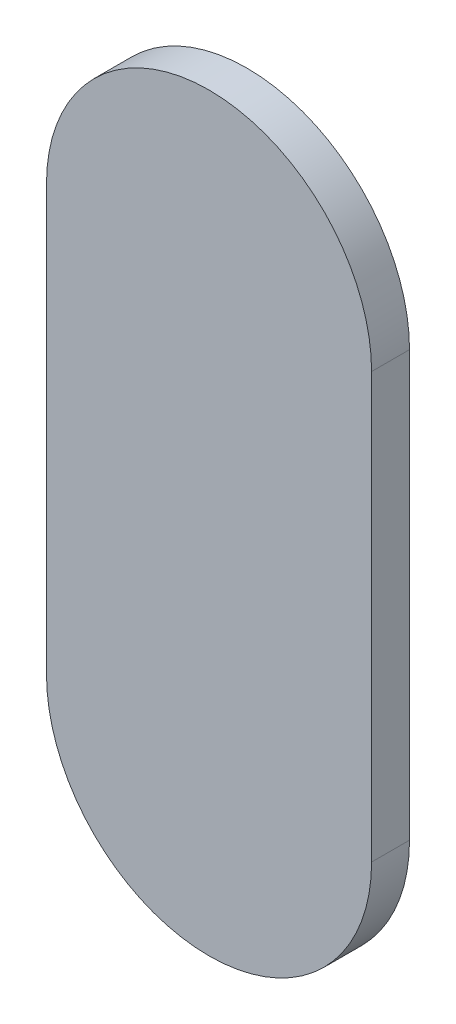
ISO-10303-21;
HEADER;
FILE_DESCRIPTION(('STEP AP214'),'2;1');
FILE_NAME('part.step','',(''),(''),'','','');
FILE_SCHEMA(('AUTOMOTIVE_DESIGN { 1 0 10303 214 1 1 1 1 }'));
ENDSEC;
DATA;
#1=APPLICATION_CONTEXT('core data for automotive mechanical design processes');
#2=APPLICATION_PROTOCOL_DEFINITION('international standard','automotive_design',2000,#1);
#3=PRODUCT_CONTEXT('',#1,'mechanical');
#4=PRODUCT('Part','Part','',(#3));
#5=PRODUCT_RELATED_PRODUCT_CATEGORY('part','',(#4));
#6=PRODUCT_DEFINITION_FORMATION('','',#4);
#7=PRODUCT_DEFINITION_CONTEXT('part definition',#1,'design');
#8=PRODUCT_DEFINITION('design','',#6,#7);
#9=PRODUCT_DEFINITION_SHAPE('','',#8);
#10=(LENGTH_UNIT() NAMED_UNIT(*) SI_UNIT(.MILLI.,.METRE.));
#11=(NAMED_UNIT(*) PLANE_ANGLE_UNIT() SI_UNIT($,.RADIAN.));
#12=(NAMED_UNIT(*) SI_UNIT($,.STERADIAN.) SOLID_ANGLE_UNIT());
#13=UNCERTAINTY_MEASURE_WITH_UNIT(LENGTH_MEASURE(1.E-05),#10,'distance_accuracy_value','');
#14=(GEOMETRIC_REPRESENTATION_CONTEXT(3) GLOBAL_UNCERTAINTY_ASSIGNED_CONTEXT((#13)) GLOBAL_UNIT_ASSIGNED_CONTEXT((#10,
#11,#12)) REPRESENTATION_CONTEXT('',''));
#15=CARTESIAN_POINT('',(0.,0.,0.));
#16=DIRECTION('',(0.,0.,1.));
#17=DIRECTION('',(1.,0.,0.));
#18=AXIS2_PLACEMENT_3D('',#15,#16,#17);
#19=CARTESIAN_POINT('',(129.151,-112.499,1.635));
#20=DIRECTION('',(0.,0.,1.));
#21=DIRECTION('',(1.,0.,0.));
#22=AXIS2_PLACEMENT_3D('',#19,#20,#21);
#23=PLANE('',#22);
#24=DIRECTION('',(0.,-1.,0.));
#25=VECTOR('',#24,1.);
#26=CARTESIAN_POINT('',(129.151,-112.499,1.635));
#27=LINE('',#26,#25);
#28=CARTESIAN_POINT('',(129.151,-112.499,1.635));
#29=VERTEX_POINT('',#28);
#30=CARTESIAN_POINT('',(129.151,-112.891,1.635));
#31=VERTEX_POINT('',#30);
#32=EDGE_CURVE('E99',#29,#31,#27,.T.);
#33=ORIENTED_EDGE('',*,*,#32,.T.);
#34=CARTESIAN_POINT('',(129.301,-112.891,1.635));
#35=DIRECTION('',(0.,0.,1.));
#36=DIRECTION('',(-1.,0.,0.));
#37=AXIS2_PLACEMENT_3D('',#34,#35,#36);
#38=CIRCLE('',#37,0.15);
#39=CARTESIAN_POINT('',(129.451,-112.891,1.635));
#40=VERTEX_POINT('',#39);
#41=EDGE_CURVE('E78',#31,#40,#38,.T.);
#42=ORIENTED_EDGE('',*,*,#41,.T.);
#43=DIRECTION('',(0.,1.,0.));
#44=VECTOR('',#43,1.);
#45=CARTESIAN_POINT('',(129.451,-112.891,1.635));
#46=LINE('',#45,#44);
#47=CARTESIAN_POINT('',(129.451,-112.499,1.635));
#48=VERTEX_POINT('',#47);
#49=EDGE_CURVE('E83',#40,#48,#46,.T.);
#50=ORIENTED_EDGE('',*,*,#49,.T.);
#51=CARTESIAN_POINT('',(129.301,-112.499,1.635));
#52=DIRECTION('',(0.,0.,1.));
#53=DIRECTION('',(1.,0.,0.));
#54=AXIS2_PLACEMENT_3D('',#51,#52,#53);
#55=CIRCLE('',#54,0.15);
#56=EDGE_CURVE('E11',#48,#29,#55,.T.);
#57=ORIENTED_EDGE('',*,*,#56,.T.);
#58=EDGE_LOOP('',(#33,#42,#50,#57));
#59=FACE_BOUND('',#58,.T.);
#60=ADVANCED_FACE('F17',(#59),#23,.T.);
#61=CARTESIAN_POINT('',(129.151,-112.499,1.6));
#62=DIRECTION('',(0.,0.,1.));
#63=DIRECTION('',(1.,0.,0.));
#64=AXIS2_PLACEMENT_3D('',#61,#62,#63);
#65=PLANE('',#64);
#66=CARTESIAN_POINT('',(129.301,-112.499,1.6));
#67=DIRECTION('',(0.,0.,1.));
#68=DIRECTION('',(1.,0.,0.));
#69=AXIS2_PLACEMENT_3D('',#66,#67,#68);
#70=CIRCLE('',#69,0.15);
#71=CARTESIAN_POINT('',(129.451,-112.499,1.6));
#72=VERTEX_POINT('',#71);
#73=CARTESIAN_POINT('',(129.151,-112.499,1.6));
#74=VERTEX_POINT('',#73);
#75=EDGE_CURVE('E21',#72,#74,#70,.T.);
#76=ORIENTED_EDGE('',*,*,#75,.F.);
#77=DIRECTION('',(0.,1.,0.));
#78=VECTOR('',#77,1.);
#79=CARTESIAN_POINT('',(129.451,-112.891,1.6));
#80=LINE('',#79,#78);
#81=CARTESIAN_POINT('',(129.451,-112.891,1.6));
#82=VERTEX_POINT('',#81);
#83=EDGE_CURVE('E69',#82,#72,#80,.T.);
#84=ORIENTED_EDGE('',*,*,#83,.F.);
#85=CARTESIAN_POINT('',(129.301,-112.891,1.6));
#86=DIRECTION('',(0.,0.,1.));
#87=DIRECTION('',(-1.,0.,0.));
#88=AXIS2_PLACEMENT_3D('',#85,#86,#87);
#89=CIRCLE('',#88,0.15);
#90=CARTESIAN_POINT('',(129.151,-112.891,1.6));
#91=VERTEX_POINT('',#90);
#92=EDGE_CURVE('E72',#91,#82,#89,.T.);
#93=ORIENTED_EDGE('',*,*,#92,.F.);
#94=DIRECTION('',(0.,-1.,0.));
#95=VECTOR('',#94,1.);
#96=CARTESIAN_POINT('',(129.151,-112.499,1.6));
#97=LINE('',#96,#95);
#98=EDGE_CURVE('E118',#74,#91,#97,.T.);
#99=ORIENTED_EDGE('',*,*,#98,.F.);
#100=EDGE_LOOP('',(#76,#84,#93,#99));
#101=FACE_BOUND('',#100,.T.);
#102=ADVANCED_FACE('F19',(#101),#65,.F.);
#103=CARTESIAN_POINT('',(129.301,-112.499,1.6));
#104=DIRECTION('',(0.,0.,-1.));
#105=DIRECTION('',(1.,0.,0.));
#106=AXIS2_PLACEMENT_3D('',#103,#104,#105);
#107=CYLINDRICAL_SURFACE('',#106,0.15);
#108=ORIENTED_EDGE('',*,*,#75,.T.);
#109=DIRECTION('',(0.,0.,1.));
#110=VECTOR('',#109,1.);
#111=CARTESIAN_POINT('',(129.151,-112.499,1.6));
#112=LINE('',#111,#110);
#113=EDGE_CURVE('E93',#74,#29,#112,.T.);
#114=ORIENTED_EDGE('',*,*,#113,.T.);
#115=ORIENTED_EDGE('',*,*,#56,.F.);
#116=DIRECTION('',(0.,0.,1.));
#117=VECTOR('',#116,1.);
#118=CARTESIAN_POINT('',(129.451,-112.499,1.6));
#119=LINE('',#118,#117);
#120=EDGE_CURVE('E77',#72,#48,#119,.T.);
#121=ORIENTED_EDGE('',*,*,#120,.F.);
#122=EDGE_LOOP('',(#108,#114,#115,#121));
#123=FACE_BOUND('',#122,.T.);
#124=ADVANCED_FACE('F126',(#123),#107,.T.);
#125=CARTESIAN_POINT('',(129.451,-112.891,1.6));
#126=DIRECTION('',(-1.,0.,0.));
#127=DIRECTION('',(0.,0.,1.));
#128=AXIS2_PLACEMENT_3D('',#125,#126,#127);
#129=PLANE('',#128);
#130=ORIENTED_EDGE('',*,*,#83,.T.);
#131=ORIENTED_EDGE('',*,*,#120,.T.);
#132=ORIENTED_EDGE('',*,*,#49,.F.);
#133=DIRECTION('',(0.,0.,1.));
#134=VECTOR('',#133,1.);
#135=CARTESIAN_POINT('',(129.451,-112.891,1.6));
#136=LINE('',#135,#134);
#137=EDGE_CURVE('E81',#82,#40,#136,.T.);
#138=ORIENTED_EDGE('',*,*,#137,.F.);
#139=EDGE_LOOP('',(#130,#131,#132,#138));
#140=FACE_BOUND('',#139,.T.);
#141=ADVANCED_FACE('F82',(#140),#129,.F.);
#142=CARTESIAN_POINT('',(129.301,-112.891,1.6));
#143=DIRECTION('',(0.,0.,-1.));
#144=DIRECTION('',(-1.,0.,0.));
#145=AXIS2_PLACEMENT_3D('',#142,#143,#144);
#146=CYLINDRICAL_SURFACE('',#145,0.15);
#147=ORIENTED_EDGE('',*,*,#92,.T.);
#148=ORIENTED_EDGE('',*,*,#137,.T.);
#149=ORIENTED_EDGE('',*,*,#41,.F.);
#150=DIRECTION('',(0.,0.,1.));
#151=VECTOR('',#150,1.);
#152=CARTESIAN_POINT('',(129.151,-112.891,1.6));
#153=LINE('',#152,#151);
#154=EDGE_CURVE('E90',#91,#31,#153,.T.);
#155=ORIENTED_EDGE('',*,*,#154,.F.);
#156=EDGE_LOOP('',(#147,#148,#149,#155));
#157=FACE_BOUND('',#156,.T.);
#158=ADVANCED_FACE('F88',(#157),#146,.T.);
#159=CARTESIAN_POINT('',(129.151,-112.499,1.6));
#160=DIRECTION('',(1.,0.,0.));
#161=DIRECTION('',(0.,1.,0.));
#162=AXIS2_PLACEMENT_3D('',#159,#160,#161);
#163=PLANE('',#162);
#164=ORIENTED_EDGE('',*,*,#98,.T.);
#165=ORIENTED_EDGE('',*,*,#154,.T.);
#166=ORIENTED_EDGE('',*,*,#32,.F.);
#167=ORIENTED_EDGE('',*,*,#113,.F.);
#168=EDGE_LOOP('',(#164,#165,#166,#167));
#169=FACE_BOUND('',#168,.T.);
#170=ADVANCED_FACE('F124',(#169),#163,.F.);
#171=CLOSED_SHELL('',(#60,#102,#124,#141,#158,#170));
#172=MANIFOLD_SOLID_BREP('B1',#171);
#173=ADVANCED_BREP_SHAPE_REPRESENTATION('',(#18,#172),#14);
#174=SHAPE_DEFINITION_REPRESENTATION(#9,#173);
ENDSEC;
END-ISO-10303-21;
